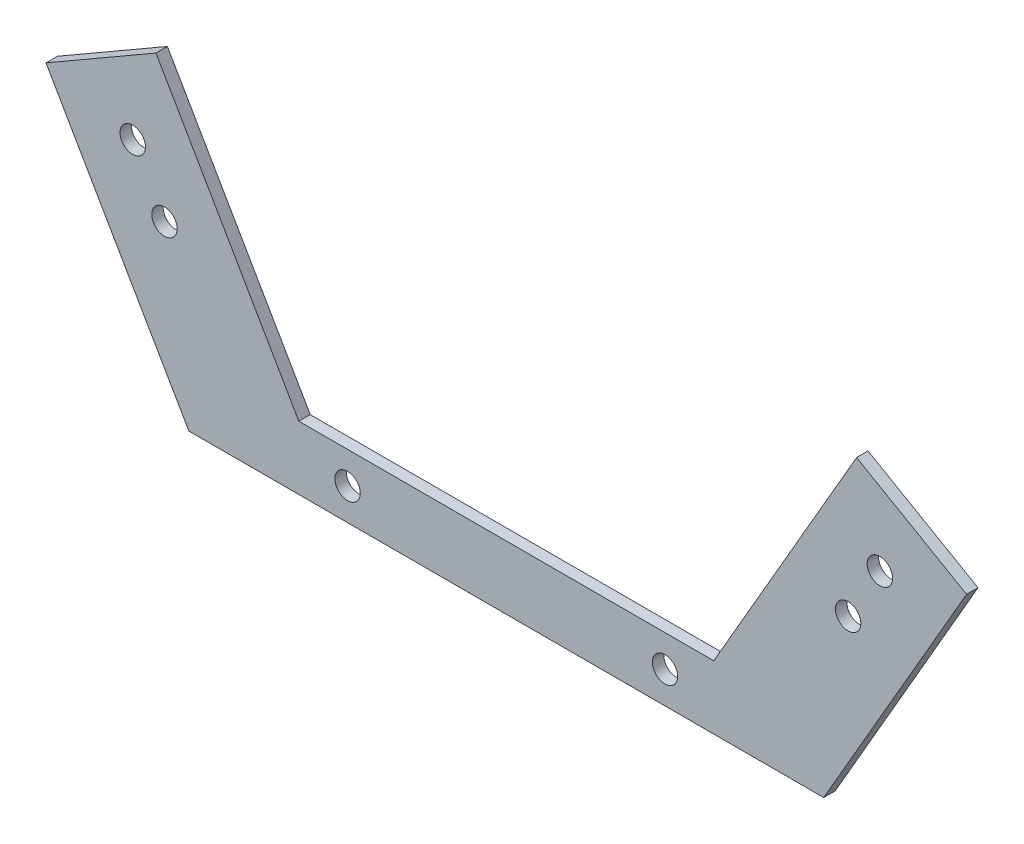
ISO-10303-21;
HEADER;
FILE_DESCRIPTION(('STEP AP214'),'2;1');
FILE_NAME('part.step','',(''),(''),'','','');
FILE_SCHEMA(('AUTOMOTIVE_DESIGN { 1 0 10303 214 1 1 1 1 }'));
ENDSEC;
DATA;
#1=APPLICATION_CONTEXT('core data for automotive mechanical design processes');
#2=APPLICATION_PROTOCOL_DEFINITION('international standard','automotive_design',2000,#1);
#3=PRODUCT_CONTEXT('',#1,'mechanical');
#4=PRODUCT('Part','Part','',(#3));
#5=PRODUCT_RELATED_PRODUCT_CATEGORY('part','',(#4));
#6=PRODUCT_DEFINITION_FORMATION('','',#4);
#7=PRODUCT_DEFINITION_CONTEXT('part definition',#1,'design');
#8=PRODUCT_DEFINITION('design','',#6,#7);
#9=PRODUCT_DEFINITION_SHAPE('','',#8);
#10=(LENGTH_UNIT() NAMED_UNIT(*) SI_UNIT(.MILLI.,.METRE.));
#11=(NAMED_UNIT(*) PLANE_ANGLE_UNIT() SI_UNIT($,.RADIAN.));
#12=(NAMED_UNIT(*) SI_UNIT($,.STERADIAN.) SOLID_ANGLE_UNIT());
#13=UNCERTAINTY_MEASURE_WITH_UNIT(LENGTH_MEASURE(1.E-05),#10,'distance_accuracy_value','');
#14=(GEOMETRIC_REPRESENTATION_CONTEXT(3) GLOBAL_UNCERTAINTY_ASSIGNED_CONTEXT((#13)) GLOBAL_UNIT_ASSIGNED_CONTEXT((#10,
#11,#12)) REPRESENTATION_CONTEXT('',''));
#15=CARTESIAN_POINT('',(0.,0.,0.));
#16=DIRECTION('',(0.,0.,1.));
#17=DIRECTION('',(1.,0.,0.));
#18=AXIS2_PLACEMENT_3D('',#15,#16,#17);
#19=CARTESIAN_POINT('',(42.5515464620786,-42.3762093747941,1.8));
#20=DIRECTION('',(0.,-1.,0.));
#21=DIRECTION('',(1.,0.,0.));
#22=AXIS2_PLACEMENT_3D('',#19,#20,#21);
#23=PLANE('',#22);
#24=DIRECTION('',(-1.,0.,0.));
#25=VECTOR('',#24,1.);
#26=CARTESIAN_POINT('',(42.5515464620786,-42.3762093747941,0.));
#27=LINE('',#26,#25);
#28=CARTESIAN_POINT('',(42.5515464620786,-42.3762093747941,0.));
#29=VERTEX_POINT('',#28);
#30=CARTESIAN_POINT('',(-22.8074373865442,-42.3762093747941,0.));
#31=VERTEX_POINT('',#30);
#32=EDGE_CURVE('E129',#29,#31,#27,.T.);
#33=ORIENTED_EDGE('',*,*,#32,.T.);
#34=DIRECTION('',(0.,0.,-1.));
#35=VECTOR('',#34,1.);
#36=CARTESIAN_POINT('',(-22.8074373865442,-42.3762093747941,1.8));
#37=LINE('',#36,#35);
#38=CARTESIAN_POINT('',(-22.8074373865442,-42.3762093747941,1.8));
#39=VERTEX_POINT('',#38);
#40=EDGE_CURVE('E11',#39,#31,#37,.T.);
#41=ORIENTED_EDGE('',*,*,#40,.F.);
#42=DIRECTION('',(-1.,0.,0.));
#43=VECTOR('',#42,1.);
#44=CARTESIAN_POINT('',(42.5515464620786,-42.3762093747941,1.8));
#45=LINE('',#44,#43);
#46=CARTESIAN_POINT('',(42.5515464620786,-42.3762093747941,1.8));
#47=VERTEX_POINT('',#46);
#48=EDGE_CURVE('E144',#47,#39,#45,.T.);
#49=ORIENTED_EDGE('',*,*,#48,.F.);
#50=DIRECTION('',(0.,0.,-1.));
#51=VECTOR('',#50,1.);
#52=CARTESIAN_POINT('',(42.5515464620786,-42.3762093747941,1.8));
#53=LINE('',#52,#51);
#54=EDGE_CURVE('E125',#47,#29,#53,.T.);
#55=ORIENTED_EDGE('',*,*,#54,.T.);
#56=EDGE_LOOP('',(#33,#41,#49,#55));
#57=FACE_BOUND('',#56,.T.);
#58=ADVANCED_FACE('F33',(#57),#23,.F.);
#59=CARTESIAN_POINT('',(-22.8074373865442,-42.3762093747941,1.8));
#60=DIRECTION('',(-0.866025403784443,-0.499999999999992,0.));
#61=DIRECTION('',(0.499999999999992,-0.866025403784443,0.));
#62=AXIS2_PLACEMENT_3D('',#59,#60,#61);
#63=PLANE('',#62);
#64=DIRECTION('',(-0.499999999999992,0.866025403784443,0.));
#65=VECTOR('',#64,1.);
#66=CARTESIAN_POINT('',(-22.8074373865442,-42.3762093747941,0.));
#67=LINE('',#66,#65);
#68=CARTESIAN_POINT('',(-45.3074373865437,-3.40506620449437,0.));
#69=VERTEX_POINT('',#68);
#70=EDGE_CURVE('E132',#31,#69,#67,.T.);
#71=ORIENTED_EDGE('',*,*,#70,.T.);
#72=DIRECTION('',(0.,0.,-1.));
#73=VECTOR('',#72,1.);
#74=CARTESIAN_POINT('',(-45.3074373865437,-3.40506620449437,1.8));
#75=LINE('',#74,#73);
#76=CARTESIAN_POINT('',(-45.3074373865437,-3.40506620449437,1.8));
#77=VERTEX_POINT('',#76);
#78=EDGE_CURVE('E41',#77,#69,#75,.T.);
#79=ORIENTED_EDGE('',*,*,#78,.F.);
#80=DIRECTION('',(-0.499999999999992,0.866025403784443,0.));
#81=VECTOR('',#80,1.);
#82=CARTESIAN_POINT('',(-22.8074373865442,-42.3762093747941,1.8));
#83=LINE('',#82,#81);
#84=EDGE_CURVE('E92',#39,#77,#83,.T.);
#85=ORIENTED_EDGE('',*,*,#84,.F.);
#86=ORIENTED_EDGE('',*,*,#40,.T.);
#87=EDGE_LOOP('',(#71,#79,#85,#86));
#88=FACE_BOUND('',#87,.T.);
#89=ADVANCED_FACE('F252',(#88),#63,.F.);
#90=CARTESIAN_POINT('',(-45.3074373865437,-3.40506620449437,1.8));
#91=DIRECTION('',(0.499999999999995,-0.866025403784442,0.));
#92=DIRECTION('',(0.866025403784442,0.499999999999995,0.));
#93=AXIS2_PLACEMENT_3D('',#90,#91,#92);
#94=PLANE('',#93);
#95=DIRECTION('',(-0.866025403784442,-0.499999999999995,0.));
#96=VECTOR('',#95,1.);
#97=CARTESIAN_POINT('',(-45.3074373865437,-3.40506620449437,0.));
#98=LINE('',#97,#96);
#99=CARTESIAN_POINT('',(-62.6279454622325,-13.4050662044943,0.));
#100=VERTEX_POINT('',#99);
#101=EDGE_CURVE('E135',#69,#100,#98,.T.);
#102=ORIENTED_EDGE('',*,*,#101,.T.);
#103=DIRECTION('',(0.,0.,-1.));
#104=VECTOR('',#103,1.);
#105=CARTESIAN_POINT('',(-62.6279454622325,-13.4050662044943,1.8));
#106=LINE('',#105,#104);
#107=CARTESIAN_POINT('',(-62.6279454622325,-13.4050662044943,1.8));
#108=VERTEX_POINT('',#107);
#109=EDGE_CURVE('E151',#108,#100,#106,.T.);
#110=ORIENTED_EDGE('',*,*,#109,.F.);
#111=DIRECTION('',(-0.866025403784442,-0.499999999999995,0.));
#112=VECTOR('',#111,1.);
#113=CARTESIAN_POINT('',(-45.3074373865437,-3.40506620449437,1.8));
#114=LINE('',#113,#112);
#115=EDGE_CURVE('E159',#77,#108,#114,.T.);
#116=ORIENTED_EDGE('',*,*,#115,.F.);
#117=ORIENTED_EDGE('',*,*,#78,.T.);
#118=EDGE_LOOP('',(#102,#110,#116,#117));
#119=FACE_BOUND('',#118,.T.);
#120=ADVANCED_FACE('F157',(#119),#94,.F.);
#121=CARTESIAN_POINT('',(-62.6279454622325,-13.4050662044943,1.8));
#122=DIRECTION('',(0.86602540378444,0.499999999999998,0.));
#123=DIRECTION('',(-0.499999999999998,0.86602540378444,0.));
#124=AXIS2_PLACEMENT_3D('',#121,#122,#123);
#125=PLANE('',#124);
#126=DIRECTION('',(0.499999999999998,-0.86602540378444,0.));
#127=VECTOR('',#126,1.);
#128=CARTESIAN_POINT('',(-62.6279454622325,-13.4050662044943,0.));
#129=LINE('',#128,#127);
#130=CARTESIAN_POINT('',(-40.1279454622326,-52.3762093747941,0.));
#131=VERTEX_POINT('',#130);
#132=EDGE_CURVE('E137',#100,#131,#129,.T.);
#133=ORIENTED_EDGE('',*,*,#132,.T.);
#134=DIRECTION('',(0.,0.,-1.));
#135=VECTOR('',#134,1.);
#136=CARTESIAN_POINT('',(-40.1279454622326,-52.3762093747941,1.8));
#137=LINE('',#136,#135);
#138=CARTESIAN_POINT('',(-40.1279454622326,-52.3762093747941,1.8));
#139=VERTEX_POINT('',#138);
#140=EDGE_CURVE('E148',#139,#131,#137,.T.);
#141=ORIENTED_EDGE('',*,*,#140,.F.);
#142=DIRECTION('',(0.499999999999998,-0.86602540378444,0.));
#143=VECTOR('',#142,1.);
#144=CARTESIAN_POINT('',(-62.6279454622325,-13.4050662044943,1.8));
#145=LINE('',#144,#143);
#146=EDGE_CURVE('E171',#108,#139,#145,.T.);
#147=ORIENTED_EDGE('',*,*,#146,.F.);
#148=ORIENTED_EDGE('',*,*,#109,.T.);
#149=EDGE_LOOP('',(#133,#141,#147,#148));
#150=FACE_BOUND('',#149,.T.);
#151=ADVANCED_FACE('F167',(#150),#125,.F.);
#152=CARTESIAN_POINT('',(-40.1279454622326,-52.3762093747941,1.8));
#153=DIRECTION('',(0.,1.,0.));
#154=DIRECTION('',(-1.,0.,0.));
#155=AXIS2_PLACEMENT_3D('',#152,#153,#154);
#156=PLANE('',#155);
#157=DIRECTION('',(1.,0.,0.));
#158=VECTOR('',#157,1.);
#159=CARTESIAN_POINT('',(-40.1279454622326,-52.3762093747941,0.));
#160=LINE('',#159,#158);
#161=CARTESIAN_POINT('',(59.8720545377674,-52.3762093747941,0.));
#162=VERTEX_POINT('',#161);
#163=EDGE_CURVE('E139',#131,#162,#160,.T.);
#164=ORIENTED_EDGE('',*,*,#163,.T.);
#165=DIRECTION('',(0.,0.,-1.));
#166=VECTOR('',#165,1.);
#167=CARTESIAN_POINT('',(59.8720545377674,-52.3762093747941,1.8));
#168=LINE('',#167,#166);
#169=CARTESIAN_POINT('',(59.8720545377674,-52.3762093747941,1.8));
#170=VERTEX_POINT('',#169);
#171=EDGE_CURVE('E120',#170,#162,#168,.T.);
#172=ORIENTED_EDGE('',*,*,#171,.F.);
#173=DIRECTION('',(1.,0.,0.));
#174=VECTOR('',#173,1.);
#175=CARTESIAN_POINT('',(-40.1279454622326,-52.3762093747941,1.8));
#176=LINE('',#175,#174);
#177=EDGE_CURVE('E111',#139,#170,#176,.T.);
#178=ORIENTED_EDGE('',*,*,#177,.F.);
#179=ORIENTED_EDGE('',*,*,#140,.T.);
#180=EDGE_LOOP('',(#164,#172,#178,#179));
#181=FACE_BOUND('',#180,.T.);
#182=ADVANCED_FACE('F170',(#181),#156,.F.);
#183=CARTESIAN_POINT('',(59.8720545377674,-52.3762093747941,1.8));
#184=DIRECTION('',(-0.866025403784445,0.499999999999989,0.));
#185=DIRECTION('',(-0.499999999999989,-0.866025403784445,0.));
#186=AXIS2_PLACEMENT_3D('',#183,#184,#185);
#187=PLANE('',#186);
#188=DIRECTION('',(0.499999999999989,0.866025403784445,0.));
#189=VECTOR('',#188,1.);
#190=CARTESIAN_POINT('',(59.8720545377674,-52.3762093747941,0.));
#191=LINE('',#190,#189);
#192=CARTESIAN_POINT('',(82.3720545377665,-13.4050662044947,0.));
#193=VERTEX_POINT('',#192);
#194=EDGE_CURVE('E119',#162,#193,#191,.T.);
#195=ORIENTED_EDGE('',*,*,#194,.T.);
#196=DIRECTION('',(0.,0.,-1.));
#197=VECTOR('',#196,1.);
#198=CARTESIAN_POINT('',(82.3720545377665,-13.4050662044947,1.8));
#199=LINE('',#198,#197);
#200=CARTESIAN_POINT('',(82.3720545377665,-13.4050662044947,1.8));
#201=VERTEX_POINT('',#200);
#202=EDGE_CURVE('E116',#201,#193,#199,.T.);
#203=ORIENTED_EDGE('',*,*,#202,.F.);
#204=DIRECTION('',(0.499999999999989,0.866025403784445,0.));
#205=VECTOR('',#204,1.);
#206=CARTESIAN_POINT('',(59.8720545377674,-52.3762093747941,1.8));
#207=LINE('',#206,#205);
#208=EDGE_CURVE('E105',#170,#201,#207,.T.);
#209=ORIENTED_EDGE('',*,*,#208,.F.);
#210=ORIENTED_EDGE('',*,*,#171,.T.);
#211=EDGE_LOOP('',(#195,#203,#209,#210));
#212=FACE_BOUND('',#211,.T.);
#213=ADVANCED_FACE('F117',(#212),#187,.F.);
#214=CARTESIAN_POINT('',(82.3720545377665,-13.4050662044947,1.8));
#215=DIRECTION('',(-0.500000000000027,-0.866025403784423,0.));
#216=DIRECTION('',(0.866025403784423,-0.500000000000027,0.));
#217=AXIS2_PLACEMENT_3D('',#214,#215,#216);
#218=PLANE('',#217);
#219=DIRECTION('',(-0.866025403784423,0.500000000000027,0.));
#220=VECTOR('',#219,1.);
#221=CARTESIAN_POINT('',(82.3720545377665,-13.4050662044947,0.));
#222=LINE('',#221,#220);
#223=CARTESIAN_POINT('',(65.0515464620784,-3.40506620449438,0.));
#224=VERTEX_POINT('',#223);
#225=EDGE_CURVE('E78',#193,#224,#222,.T.);
#226=ORIENTED_EDGE('',*,*,#225,.T.);
#227=DIRECTION('',(0.,0.,-1.));
#228=VECTOR('',#227,1.);
#229=CARTESIAN_POINT('',(65.0515464620784,-3.40506620449438,1.8));
#230=LINE('',#229,#228);
#231=CARTESIAN_POINT('',(65.0515464620784,-3.40506620449438,1.8));
#232=VERTEX_POINT('',#231);
#233=EDGE_CURVE('E121',#232,#224,#230,.T.);
#234=ORIENTED_EDGE('',*,*,#233,.F.);
#235=DIRECTION('',(-0.866025403784423,0.500000000000027,0.));
#236=VECTOR('',#235,1.);
#237=CARTESIAN_POINT('',(82.3720545377665,-13.4050662044947,1.8));
#238=LINE('',#237,#236);
#239=EDGE_CURVE('E109',#201,#232,#238,.T.);
#240=ORIENTED_EDGE('',*,*,#239,.F.);
#241=ORIENTED_EDGE('',*,*,#202,.T.);
#242=EDGE_LOOP('',(#226,#234,#240,#241));
#243=FACE_BOUND('',#242,.T.);
#244=ADVANCED_FACE('F123',(#243),#218,.F.);
#245=CARTESIAN_POINT('',(65.0515464620784,-3.40506620449438,1.8));
#246=DIRECTION('',(0.86602540378444,-0.499999999999998,0.));
#247=DIRECTION('',(0.499999999999998,0.86602540378444,0.));
#248=AXIS2_PLACEMENT_3D('',#245,#246,#247);
#249=PLANE('',#248);
#250=DIRECTION('',(-0.499999999999998,-0.86602540378444,0.));
#251=VECTOR('',#250,1.);
#252=CARTESIAN_POINT('',(65.0515464620784,-3.40506620449438,0.));
#253=LINE('',#252,#251);
#254=EDGE_CURVE('E84',#224,#29,#253,.T.);
#255=ORIENTED_EDGE('',*,*,#254,.T.);
#256=ORIENTED_EDGE('',*,*,#54,.F.);
#257=DIRECTION('',(-0.499999999999998,-0.86602540378444,0.));
#258=VECTOR('',#257,1.);
#259=CARTESIAN_POINT('',(65.0515464620784,-3.40506620449438,1.8));
#260=LINE('',#259,#258);
#261=EDGE_CURVE('E49',#232,#47,#260,.T.);
#262=ORIENTED_EDGE('',*,*,#261,.F.);
#263=ORIENTED_EDGE('',*,*,#233,.T.);
#264=EDGE_LOOP('',(#255,#256,#262,#263));
#265=FACE_BOUND('',#264,.T.);
#266=ADVANCED_FACE('F224',(#265),#249,.F.);
#267=CARTESIAN_POINT('',(0.,0.,1.8));
#268=DIRECTION('',(0.,0.,-1.));
#269=DIRECTION('',(-1.,0.,0.));
#270=AXIS2_PLACEMENT_3D('',#267,#268,#269);
#271=PLANE('',#270);
#272=CARTESIAN_POINT('',(68.7118004999226,-17.0653202423394,1.8));
#273=DIRECTION('',(0.,0.,1.));
#274=DIRECTION('',(1.,0.,0.));
#275=AXIS2_PLACEMENT_3D('',#272,#273,#274);
#276=CIRCLE('',#275,2.);
#277=CARTESIAN_POINT('',(70.7118004999226,-17.0653202423394,1.8));
#278=VERTEX_POINT('',#277);
#279=EDGE_CURVE('E202',#278,#278,#276,.T.);
#280=ORIENTED_EDGE('',*,*,#279,.F.);
#281=EDGE_LOOP('',(#280));
#282=FACE_BOUND('',#281,.T.);
#283=CARTESIAN_POINT('',(-15.1279454622326,-47.3762093747941,1.8));
#284=DIRECTION('',(0.,0.,1.));
#285=DIRECTION('',(1.,0.,0.));
#286=AXIS2_PLACEMENT_3D('',#283,#284,#285);
#287=CIRCLE('',#286,2.);
#288=CARTESIAN_POINT('',(-13.1279454622326,-47.3762093747941,1.8));
#289=VERTEX_POINT('',#288);
#290=EDGE_CURVE('E181',#289,#289,#287,.T.);
#291=ORIENTED_EDGE('',*,*,#290,.F.);
#292=EDGE_LOOP('',(#291));
#293=FACE_BOUND('',#292,.T.);
#294=CARTESIAN_POINT('',(34.8720545377674,-47.3762093747941,1.8));
#295=DIRECTION('',(0.,0.,1.));
#296=DIRECTION('',(1.,0.,0.));
#297=AXIS2_PLACEMENT_3D('',#294,#295,#296);
#298=CIRCLE('',#297,2.);
#299=CARTESIAN_POINT('',(36.8720545377674,-47.3762093747941,1.8));
#300=VERTEX_POINT('',#299);
#301=EDGE_CURVE('E180',#300,#300,#298,.T.);
#302=ORIENTED_EDGE('',*,*,#301,.F.);
#303=EDGE_LOOP('',(#302));
#304=FACE_BOUND('',#303,.T.);
#305=CARTESIAN_POINT('',(63.7118004999225,-25.7255742801837,1.8));
#306=DIRECTION('',(0.,0.,1.));
#307=DIRECTION('',(1.,0.,0.));
#308=AXIS2_PLACEMENT_3D('',#305,#306,#307);
#309=CIRCLE('',#308,2.);
#310=CARTESIAN_POINT('',(65.7118004999225,-25.7255742801837,1.8));
#311=VERTEX_POINT('',#310);
#312=EDGE_CURVE('E187',#311,#311,#309,.T.);
#313=ORIENTED_EDGE('',*,*,#312,.F.);
#314=EDGE_LOOP('',(#313));
#315=FACE_BOUND('',#314,.T.);
#316=CARTESIAN_POINT('',(-48.9676914243885,-17.065320242339,1.8));
#317=DIRECTION('',(0.,0.,1.));
#318=DIRECTION('',(1.,0.,0.));
#319=AXIS2_PLACEMENT_3D('',#316,#317,#318);
#320=CIRCLE('',#319,2.);
#321=CARTESIAN_POINT('',(-46.9676914243885,-17.065320242339,1.8));
#322=VERTEX_POINT('',#321);
#323=EDGE_CURVE('E193',#322,#322,#320,.T.);
#324=ORIENTED_EDGE('',*,*,#323,.F.);
#325=EDGE_LOOP('',(#324));
#326=FACE_BOUND('',#325,.T.);
#327=CARTESIAN_POINT('',(-43.9676914243881,-25.7255742801831,1.8));
#328=DIRECTION('',(0.,0.,1.));
#329=DIRECTION('',(1.,0.,0.));
#330=AXIS2_PLACEMENT_3D('',#327,#328,#329);
#331=CIRCLE('',#330,2.);
#332=CARTESIAN_POINT('',(-41.9676914243881,-25.7255742801831,1.8));
#333=VERTEX_POINT('',#332);
#334=EDGE_CURVE('E199',#333,#333,#331,.T.);
#335=ORIENTED_EDGE('',*,*,#334,.F.);
#336=EDGE_LOOP('',(#335));
#337=FACE_BOUND('',#336,.T.);
#338=ORIENTED_EDGE('',*,*,#48,.T.);
#339=ORIENTED_EDGE('',*,*,#84,.T.);
#340=ORIENTED_EDGE('',*,*,#115,.T.);
#341=ORIENTED_EDGE('',*,*,#146,.T.);
#342=ORIENTED_EDGE('',*,*,#177,.T.);
#343=ORIENTED_EDGE('',*,*,#208,.T.);
#344=ORIENTED_EDGE('',*,*,#239,.T.);
#345=ORIENTED_EDGE('',*,*,#261,.T.);
#346=EDGE_LOOP('',(#338,#339,#340,#341,#342,#343,#344,#345));
#347=FACE_BOUND('',#346,.T.);
#348=ADVANCED_FACE('F107',(#282,#293,#304,#315,#326,#337,#347),#271,.F.);
#349=CARTESIAN_POINT('',(0.,0.,0.));
#350=DIRECTION('',(0.,0.,-1.));
#351=DIRECTION('',(-1.,0.,0.));
#352=AXIS2_PLACEMENT_3D('',#349,#350,#351);
#353=PLANE('',#352);
#354=CARTESIAN_POINT('',(68.7118004999226,-17.0653202423394,0.));
#355=DIRECTION('',(0.,0.,1.));
#356=DIRECTION('',(1.,0.,0.));
#357=AXIS2_PLACEMENT_3D('',#354,#355,#356);
#358=CIRCLE('',#357,2.);
#359=CARTESIAN_POINT('',(70.7118004999226,-17.0653202423394,0.));
#360=VERTEX_POINT('',#359);
#361=EDGE_CURVE('E133',#360,#360,#358,.T.);
#362=ORIENTED_EDGE('',*,*,#361,.T.);
#363=EDGE_LOOP('',(#362));
#364=FACE_BOUND('',#363,.T.);
#365=CARTESIAN_POINT('',(-15.1279454622326,-47.3762093747941,0.));
#366=DIRECTION('',(0.,0.,1.));
#367=DIRECTION('',(1.,0.,0.));
#368=AXIS2_PLACEMENT_3D('',#365,#366,#367);
#369=CIRCLE('',#368,2.);
#370=CARTESIAN_POINT('',(-13.1279454622326,-47.3762093747941,0.));
#371=VERTEX_POINT('',#370);
#372=EDGE_CURVE('E203',#371,#371,#369,.T.);
#373=ORIENTED_EDGE('',*,*,#372,.T.);
#374=EDGE_LOOP('',(#373));
#375=FACE_BOUND('',#374,.T.);
#376=CARTESIAN_POINT('',(34.8720545377674,-47.3762093747941,0.));
#377=DIRECTION('',(0.,0.,1.));
#378=DIRECTION('',(1.,0.,0.));
#379=AXIS2_PLACEMENT_3D('',#376,#377,#378);
#380=CIRCLE('',#379,2.);
#381=CARTESIAN_POINT('',(36.8720545377674,-47.3762093747941,0.));
#382=VERTEX_POINT('',#381);
#383=EDGE_CURVE('E177',#382,#382,#380,.T.);
#384=ORIENTED_EDGE('',*,*,#383,.T.);
#385=EDGE_LOOP('',(#384));
#386=FACE_BOUND('',#385,.T.);
#387=CARTESIAN_POINT('',(63.7118004999225,-25.7255742801837,0.));
#388=DIRECTION('',(0.,0.,1.));
#389=DIRECTION('',(1.,0.,0.));
#390=AXIS2_PLACEMENT_3D('',#387,#388,#389);
#391=CIRCLE('',#390,2.);
#392=CARTESIAN_POINT('',(65.7118004999225,-25.7255742801837,0.));
#393=VERTEX_POINT('',#392);
#394=EDGE_CURVE('E184',#393,#393,#391,.T.);
#395=ORIENTED_EDGE('',*,*,#394,.T.);
#396=EDGE_LOOP('',(#395));
#397=FACE_BOUND('',#396,.T.);
#398=CARTESIAN_POINT('',(-48.9676914243885,-17.065320242339,0.));
#399=DIRECTION('',(0.,0.,1.));
#400=DIRECTION('',(1.,0.,0.));
#401=AXIS2_PLACEMENT_3D('',#398,#399,#400);
#402=CIRCLE('',#401,2.);
#403=CARTESIAN_POINT('',(-46.9676914243885,-17.065320242339,0.));
#404=VERTEX_POINT('',#403);
#405=EDGE_CURVE('E190',#404,#404,#402,.T.);
#406=ORIENTED_EDGE('',*,*,#405,.T.);
#407=EDGE_LOOP('',(#406));
#408=FACE_BOUND('',#407,.T.);
#409=CARTESIAN_POINT('',(-43.9676914243881,-25.7255742801831,0.));
#410=DIRECTION('',(0.,0.,1.));
#411=DIRECTION('',(1.,0.,0.));
#412=AXIS2_PLACEMENT_3D('',#409,#410,#411);
#413=CIRCLE('',#412,2.);
#414=CARTESIAN_POINT('',(-41.9676914243881,-25.7255742801831,0.));
#415=VERTEX_POINT('',#414);
#416=EDGE_CURVE('E196',#415,#415,#413,.T.);
#417=ORIENTED_EDGE('',*,*,#416,.T.);
#418=EDGE_LOOP('',(#417));
#419=FACE_BOUND('',#418,.T.);
#420=ORIENTED_EDGE('',*,*,#32,.F.);
#421=ORIENTED_EDGE('',*,*,#254,.F.);
#422=ORIENTED_EDGE('',*,*,#225,.F.);
#423=ORIENTED_EDGE('',*,*,#194,.F.);
#424=ORIENTED_EDGE('',*,*,#163,.F.);
#425=ORIENTED_EDGE('',*,*,#132,.F.);
#426=ORIENTED_EDGE('',*,*,#101,.F.);
#427=ORIENTED_EDGE('',*,*,#70,.F.);
#428=EDGE_LOOP('',(#420,#421,#422,#423,#424,#425,#426,#427));
#429=FACE_BOUND('',#428,.T.);
#430=ADVANCED_FACE('F163',(#364,#375,#386,#397,#408,#419,#429),#353,.T.);
#431=CARTESIAN_POINT('',(-43.9676914243881,-25.7255742801831,0.));
#432=DIRECTION('',(0.,0.,1.));
#433=DIRECTION('',(1.,0.,0.));
#434=AXIS2_PLACEMENT_3D('',#431,#432,#433);
#435=CYLINDRICAL_SURFACE('',#434,2.);
#436=ORIENTED_EDGE('',*,*,#416,.F.);
#437=EDGE_LOOP('',(#436));
#438=FACE_BOUND('',#437,.T.);
#439=ORIENTED_EDGE('',*,*,#334,.T.);
#440=EDGE_LOOP('',(#439));
#441=FACE_BOUND('',#440,.T.);
#442=ADVANCED_FACE('F236',(#438,#441),#435,.F.);
#443=CARTESIAN_POINT('',(-48.9676914243885,-17.065320242339,0.));
#444=DIRECTION('',(0.,0.,1.));
#445=DIRECTION('',(1.,0.,0.));
#446=AXIS2_PLACEMENT_3D('',#443,#444,#445);
#447=CYLINDRICAL_SURFACE('',#446,2.);
#448=ORIENTED_EDGE('',*,*,#405,.F.);
#449=EDGE_LOOP('',(#448));
#450=FACE_BOUND('',#449,.T.);
#451=ORIENTED_EDGE('',*,*,#323,.T.);
#452=EDGE_LOOP('',(#451));
#453=FACE_BOUND('',#452,.T.);
#454=ADVANCED_FACE('F238',(#450,#453),#447,.F.);
#455=CARTESIAN_POINT('',(63.7118004999225,-25.7255742801837,0.));
#456=DIRECTION('',(0.,0.,1.));
#457=DIRECTION('',(1.,0.,0.));
#458=AXIS2_PLACEMENT_3D('',#455,#456,#457);
#459=CYLINDRICAL_SURFACE('',#458,2.);
#460=ORIENTED_EDGE('',*,*,#394,.F.);
#461=EDGE_LOOP('',(#460));
#462=FACE_BOUND('',#461,.T.);
#463=ORIENTED_EDGE('',*,*,#312,.T.);
#464=EDGE_LOOP('',(#463));
#465=FACE_BOUND('',#464,.T.);
#466=ADVANCED_FACE('F245',(#462,#465),#459,.F.);
#467=CARTESIAN_POINT('',(34.8720545377674,-47.3762093747941,0.));
#468=DIRECTION('',(0.,0.,1.));
#469=DIRECTION('',(1.,0.,0.));
#470=AXIS2_PLACEMENT_3D('',#467,#468,#469);
#471=CYLINDRICAL_SURFACE('',#470,2.);
#472=ORIENTED_EDGE('',*,*,#383,.F.);
#473=EDGE_LOOP('',(#472));
#474=FACE_BOUND('',#473,.T.);
#475=ORIENTED_EDGE('',*,*,#301,.T.);
#476=EDGE_LOOP('',(#475));
#477=FACE_BOUND('',#476,.T.);
#478=ADVANCED_FACE('F328',(#474,#477),#471,.F.);
#479=CARTESIAN_POINT('',(-15.1279454622326,-47.3762093747941,0.));
#480=DIRECTION('',(0.,0.,1.));
#481=DIRECTION('',(1.,0.,0.));
#482=AXIS2_PLACEMENT_3D('',#479,#480,#481);
#483=CYLINDRICAL_SURFACE('',#482,2.);
#484=ORIENTED_EDGE('',*,*,#372,.F.);
#485=EDGE_LOOP('',(#484));
#486=FACE_BOUND('',#485,.T.);
#487=ORIENTED_EDGE('',*,*,#290,.T.);
#488=EDGE_LOOP('',(#487));
#489=FACE_BOUND('',#488,.T.);
#490=ADVANCED_FACE('F218',(#486,#489),#483,.F.);
#491=CARTESIAN_POINT('',(68.7118004999226,-17.0653202423394,0.));
#492=DIRECTION('',(0.,0.,1.));
#493=DIRECTION('',(1.,0.,0.));
#494=AXIS2_PLACEMENT_3D('',#491,#492,#493);
#495=CYLINDRICAL_SURFACE('',#494,2.);
#496=ORIENTED_EDGE('',*,*,#361,.F.);
#497=EDGE_LOOP('',(#496));
#498=FACE_BOUND('',#497,.T.);
#499=ORIENTED_EDGE('',*,*,#279,.T.);
#500=EDGE_LOOP('',(#499));
#501=FACE_BOUND('',#500,.T.);
#502=ADVANCED_FACE('F215',(#498,#501),#495,.F.);
#503=CLOSED_SHELL('',(#58,#89,#120,#151,#182,#213,#244,#266,#348,#430,#442,#454,#466,#478,#490,#502));
#504=MANIFOLD_SOLID_BREP('B2',#503);
#505=ADVANCED_BREP_SHAPE_REPRESENTATION('',(#18,#504),#14);
#506=SHAPE_DEFINITION_REPRESENTATION(#9,#505);
ENDSEC;
END-ISO-10303-21;
